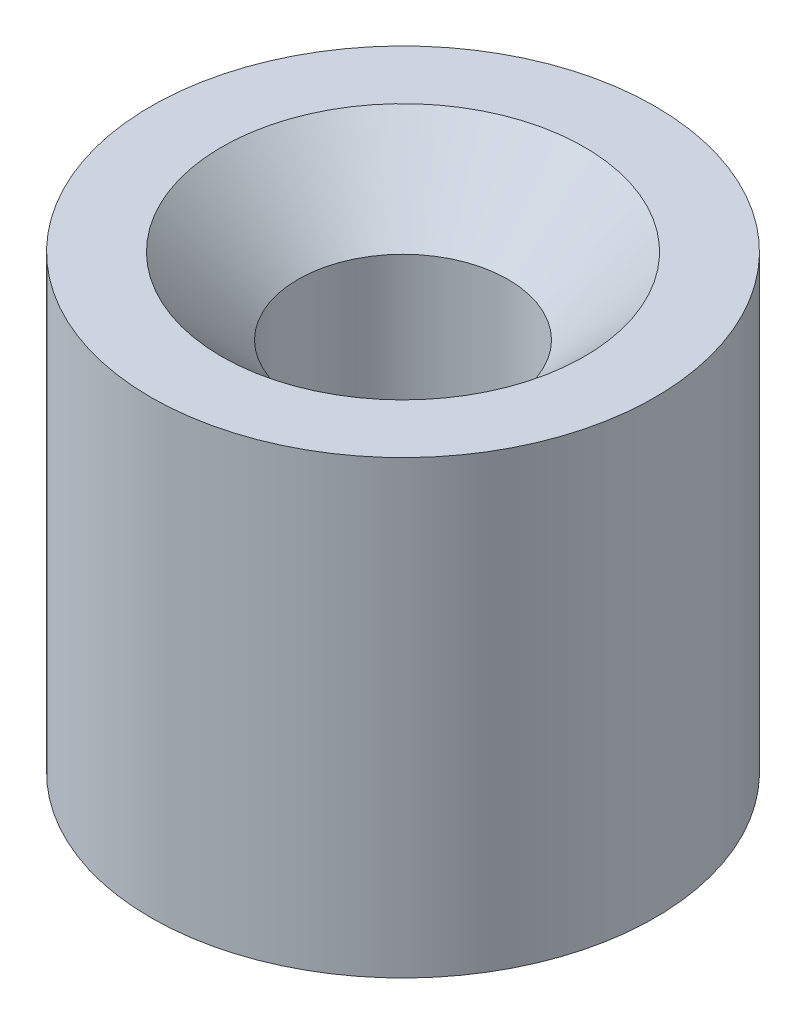
ISO-10303-21;
HEADER;
FILE_DESCRIPTION(('STEP AP214'),'2;1');
FILE_NAME('part.step','',(''),(''),'','','');
FILE_SCHEMA(('AUTOMOTIVE_DESIGN { 1 0 10303 214 1 1 1 1 }'));
ENDSEC;
DATA;
#1=APPLICATION_CONTEXT('core data for automotive mechanical design processes');
#2=APPLICATION_PROTOCOL_DEFINITION('international standard','automotive_design',2000,#1);
#3=PRODUCT_CONTEXT('',#1,'mechanical');
#4=PRODUCT('Part','Part','',(#3));
#5=PRODUCT_RELATED_PRODUCT_CATEGORY('part','',(#4));
#6=PRODUCT_DEFINITION_FORMATION('','',#4);
#7=PRODUCT_DEFINITION_CONTEXT('part definition',#1,'design');
#8=PRODUCT_DEFINITION('design','',#6,#7);
#9=PRODUCT_DEFINITION_SHAPE('','',#8);
#10=(LENGTH_UNIT() NAMED_UNIT(*) SI_UNIT(.MILLI.,.METRE.));
#11=(NAMED_UNIT(*) PLANE_ANGLE_UNIT() SI_UNIT($,.RADIAN.));
#12=(NAMED_UNIT(*) SI_UNIT($,.STERADIAN.) SOLID_ANGLE_UNIT());
#13=UNCERTAINTY_MEASURE_WITH_UNIT(LENGTH_MEASURE(1.E-05),#10,'distance_accuracy_value','');
#14=(GEOMETRIC_REPRESENTATION_CONTEXT(3) GLOBAL_UNCERTAINTY_ASSIGNED_CONTEXT((#13)) GLOBAL_UNIT_ASSIGNED_CONTEXT((#10,
#11,#12)) REPRESENTATION_CONTEXT('',''));
#15=CARTESIAN_POINT('',(0.,0.,0.));
#16=DIRECTION('',(0.,0.,1.));
#17=DIRECTION('',(1.,0.,0.));
#18=AXIS2_PLACEMENT_3D('',#15,#16,#17);
#19=CARTESIAN_POINT('',(0.,11.8,0.));
#20=DIRECTION('',(0.,-1.,0.));
#21=DIRECTION('',(0.,0.,-1.));
#22=AXIS2_PLACEMENT_3D('',#19,#20,#21);
#23=CYLINDRICAL_SURFACE('',#22,2.75);
#24=CARTESIAN_POINT('',(0.,2.00000000000001,0.));
#25=DIRECTION('',(0.,1.,0.));
#26=DIRECTION('',(0.,0.,1.));
#27=AXIS2_PLACEMENT_3D('',#24,#25,#26);
#28=CIRCLE('',#27,2.75);
#29=CARTESIAN_POINT('',(0.,2.00000000000001,2.75));
#30=VERTEX_POINT('',#29);
#31=EDGE_CURVE('E56',#30,#30,#28,.F.);
#32=ORIENTED_EDGE('',*,*,#31,.T.);
#33=EDGE_LOOP('',(#32));
#34=FACE_BOUND('',#33,.T.);
#35=CARTESIAN_POINT('',(0.,9.8,0.));
#36=DIRECTION('',(0.,1.,0.));
#37=DIRECTION('',(0.,0.,1.));
#38=AXIS2_PLACEMENT_3D('',#35,#36,#37);
#39=CIRCLE('',#38,2.75);
#40=CARTESIAN_POINT('',(0.,9.8,2.75));
#41=VERTEX_POINT('',#40);
#42=EDGE_CURVE('E61',#41,#41,#39,.T.);
#43=ORIENTED_EDGE('',*,*,#42,.T.);
#44=EDGE_LOOP('',(#43));
#45=FACE_BOUND('',#44,.T.);
#46=ADVANCED_FACE('F47',(#34,#45),#23,.F.);
#47=CARTESIAN_POINT('',(0.,11.8,0.));
#48=DIRECTION('',(0.,-1.,0.));
#49=DIRECTION('',(0.,0.,-1.));
#50=AXIS2_PLACEMENT_3D('',#47,#48,#49);
#51=CYLINDRICAL_SURFACE('',#50,6.6);
#52=CARTESIAN_POINT('',(0.,11.8,0.));
#53=DIRECTION('',(0.,1.,0.));
#54=DIRECTION('',(0.,0.,1.));
#55=AXIS2_PLACEMENT_3D('',#52,#53,#54);
#56=CIRCLE('',#55,6.6);
#57=CARTESIAN_POINT('',(0.,11.8,6.6));
#58=VERTEX_POINT('',#57);
#59=EDGE_CURVE('E72',#58,#58,#56,.T.);
#60=ORIENTED_EDGE('',*,*,#59,.F.);
#61=EDGE_LOOP('',(#60));
#62=FACE_BOUND('',#61,.T.);
#63=CARTESIAN_POINT('',(0.,0.,0.));
#64=DIRECTION('',(0.,1.,0.));
#65=DIRECTION('',(0.,0.,1.));
#66=AXIS2_PLACEMENT_3D('',#63,#64,#65);
#67=CIRCLE('',#66,6.6);
#68=CARTESIAN_POINT('',(0.,0.,6.6));
#69=VERTEX_POINT('',#68);
#70=EDGE_CURVE('E73',#69,#69,#67,.T.);
#71=ORIENTED_EDGE('',*,*,#70,.T.);
#72=EDGE_LOOP('',(#71));
#73=FACE_BOUND('',#72,.T.);
#74=ADVANCED_FACE('F83',(#62,#73),#51,.T.);
#75=CARTESIAN_POINT('',(0.,11.8,0.));
#76=DIRECTION('',(0.,1.,0.));
#77=DIRECTION('',(0.,0.,1.));
#78=AXIS2_PLACEMENT_3D('',#75,#76,#77);
#79=PLANE('',#78);
#80=CARTESIAN_POINT('',(0.,11.8,0.));
#81=DIRECTION('',(0.,1.,0.));
#82=DIRECTION('',(0.,0.,1.));
#83=AXIS2_PLACEMENT_3D('',#80,#81,#82);
#84=CIRCLE('',#83,4.75000000000001);
#85=CARTESIAN_POINT('',(0.,11.8,4.75000000000001));
#86=VERTEX_POINT('',#85);
#87=EDGE_CURVE('E10',#86,#86,#84,.F.);
#88=ORIENTED_EDGE('',*,*,#87,.T.);
#89=EDGE_LOOP('',(#88));
#90=FACE_BOUND('',#89,.T.);
#91=ORIENTED_EDGE('',*,*,#59,.T.);
#92=EDGE_LOOP('',(#91));
#93=FACE_BOUND('',#92,.T.);
#94=ADVANCED_FACE('F81',(#90,#93),#79,.T.);
#95=CARTESIAN_POINT('',(0.,0.,0.));
#96=DIRECTION('',(0.,1.,0.));
#97=DIRECTION('',(0.,0.,1.));
#98=AXIS2_PLACEMENT_3D('',#95,#96,#97);
#99=PLANE('',#98);
#100=CARTESIAN_POINT('',(0.,0.,0.));
#101=DIRECTION('',(0.,1.,0.));
#102=DIRECTION('',(0.,0.,1.));
#103=AXIS2_PLACEMENT_3D('',#100,#101,#102);
#104=CIRCLE('',#103,4.75);
#105=CARTESIAN_POINT('',(0.,0.,4.75));
#106=VERTEX_POINT('',#105);
#107=EDGE_CURVE('E66',#106,#106,#104,.T.);
#108=ORIENTED_EDGE('',*,*,#107,.T.);
#109=EDGE_LOOP('',(#108));
#110=FACE_BOUND('',#109,.T.);
#111=ORIENTED_EDGE('',*,*,#70,.F.);
#112=EDGE_LOOP('',(#111));
#113=FACE_BOUND('',#112,.T.);
#114=ADVANCED_FACE('F89',(#110,#113),#99,.F.);
#115=CARTESIAN_POINT('',(0.,0.,0.));
#116=DIRECTION('',(0.,-1.,0.));
#117=DIRECTION('',(0.,0.,-1.));
#118=AXIS2_PLACEMENT_3D('',#115,#116,#117);
#119=CONICAL_SURFACE('',#118,4.75,0.785398163397446);
#120=ORIENTED_EDGE('',*,*,#31,.F.);
#121=EDGE_LOOP('',(#120));
#122=FACE_BOUND('',#121,.T.);
#123=ORIENTED_EDGE('',*,*,#107,.F.);
#124=EDGE_LOOP('',(#123));
#125=FACE_BOUND('',#124,.T.);
#126=ADVANCED_FACE('F91',(#122,#125),#119,.F.);
#127=CARTESIAN_POINT('',(0.,9.8,0.));
#128=DIRECTION('',(0.,1.,0.));
#129=DIRECTION('',(0.,0.,1.));
#130=AXIS2_PLACEMENT_3D('',#127,#128,#129);
#131=CONICAL_SURFACE('',#130,2.75,0.78539816339745);
#132=ORIENTED_EDGE('',*,*,#87,.F.);
#133=EDGE_LOOP('',(#132));
#134=FACE_BOUND('',#133,.T.);
#135=ORIENTED_EDGE('',*,*,#42,.F.);
#136=EDGE_LOOP('',(#135));
#137=FACE_BOUND('',#136,.T.);
#138=ADVANCED_FACE('F50',(#134,#137),#131,.F.);
#139=CLOSED_SHELL('',(#46,#74,#94,#114,#126,#138));
#140=MANIFOLD_SOLID_BREP('B2',#139);
#141=ADVANCED_BREP_SHAPE_REPRESENTATION('',(#18,#140),#14);
#142=SHAPE_DEFINITION_REPRESENTATION(#9,#141);
ENDSEC;
END-ISO-10303-21;
